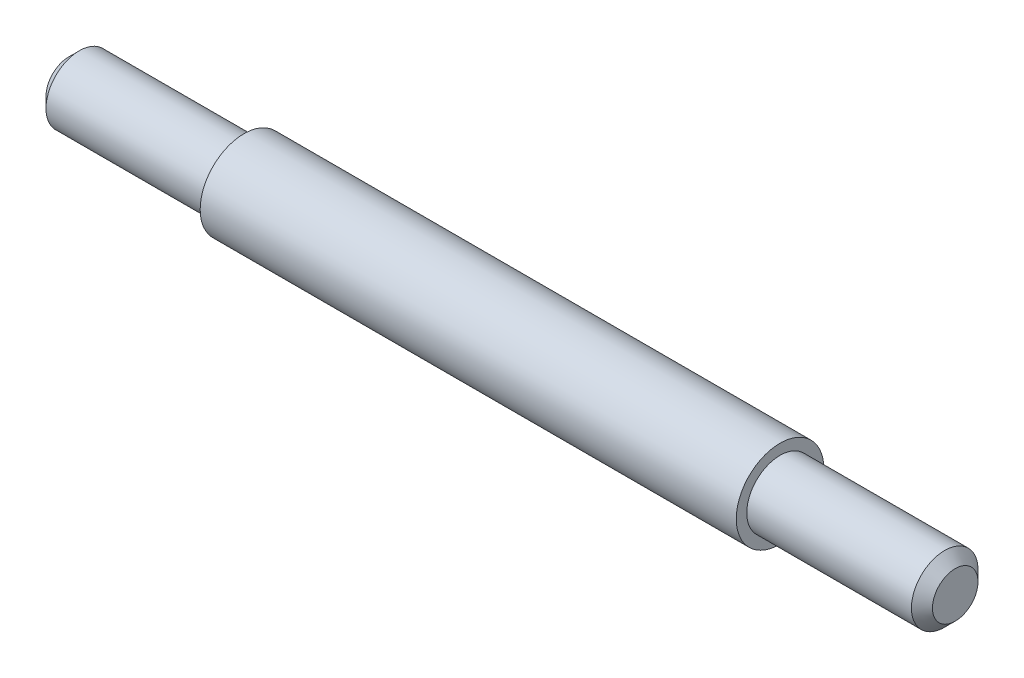
ISO-10303-21;
HEADER;
FILE_DESCRIPTION(('STEP AP214'),'2;1');
FILE_NAME('part.step','',(''),(''),'','','');
FILE_SCHEMA(('AUTOMOTIVE_DESIGN { 1 0 10303 214 1 1 1 1 }'));
ENDSEC;
DATA;
#1=APPLICATION_CONTEXT('core data for automotive mechanical design processes');
#2=APPLICATION_PROTOCOL_DEFINITION('international standard','automotive_design',2000,#1);
#3=PRODUCT_CONTEXT('',#1,'mechanical');
#4=PRODUCT('Part','Part','',(#3));
#5=PRODUCT_RELATED_PRODUCT_CATEGORY('part','',(#4));
#6=PRODUCT_DEFINITION_FORMATION('','',#4);
#7=PRODUCT_DEFINITION_CONTEXT('part definition',#1,'design');
#8=PRODUCT_DEFINITION('design','',#6,#7);
#9=PRODUCT_DEFINITION_SHAPE('','',#8);
#10=(LENGTH_UNIT() NAMED_UNIT(*) SI_UNIT(.MILLI.,.METRE.));
#11=(NAMED_UNIT(*) PLANE_ANGLE_UNIT() SI_UNIT($,.RADIAN.));
#12=(NAMED_UNIT(*) SI_UNIT($,.STERADIAN.) SOLID_ANGLE_UNIT());
#13=UNCERTAINTY_MEASURE_WITH_UNIT(LENGTH_MEASURE(1.E-05),#10,'distance_accuracy_value','');
#14=(GEOMETRIC_REPRESENTATION_CONTEXT(3) GLOBAL_UNCERTAINTY_ASSIGNED_CONTEXT((#13)) GLOBAL_UNIT_ASSIGNED_CONTEXT((#10,
#11,#12)) REPRESENTATION_CONTEXT('',''));
#15=CARTESIAN_POINT('',(0.,0.,0.));
#16=DIRECTION('',(0.,0.,1.));
#17=DIRECTION('',(1.,0.,0.));
#18=AXIS2_PLACEMENT_3D('',#15,#16,#17);
#19=CARTESIAN_POINT('',(-32.131,0.,0.));
#20=DIRECTION('',(1.,0.,0.));
#21=DIRECTION('',(0.,0.,-1.));
#22=AXIS2_PLACEMENT_3D('',#19,#20,#21);
#23=PLANE('',#22);
#24=CARTESIAN_POINT('',(-32.131,0.,0.));
#25=DIRECTION('',(1.,0.,0.));
#26=DIRECTION('',(0.,0.,-1.));
#27=AXIS2_PLACEMENT_3D('',#24,#25,#26);
#28=CIRCLE('',#27,1.651);
#29=CARTESIAN_POINT('',(-32.131,0.,-1.651));
#30=VERTEX_POINT('',#29);
#31=EDGE_CURVE('E62',#30,#30,#28,.F.);
#32=ORIENTED_EDGE('',*,*,#31,.T.);
#33=EDGE_LOOP('',(#32));
#34=FACE_BOUND('',#33,.T.);
#35=ADVANCED_FACE('F43',(#34),#23,.F.);
#36=CARTESIAN_POINT('',(-32.131,0.,0.));
#37=DIRECTION('',(-1.,0.,0.));
#38=DIRECTION('',(0.,0.,1.));
#39=AXIS2_PLACEMENT_3D('',#36,#37,#38);
#40=CYLINDRICAL_SURFACE('',#39,2.413);
#41=CARTESIAN_POINT('',(-31.369,0.,0.));
#42=DIRECTION('',(1.,0.,0.));
#43=DIRECTION('',(0.,0.,-1.));
#44=AXIS2_PLACEMENT_3D('',#41,#42,#43);
#45=CIRCLE('',#44,2.413);
#46=CARTESIAN_POINT('',(-31.369,0.,-2.413));
#47=VERTEX_POINT('',#46);
#48=EDGE_CURVE('E57',#47,#47,#45,.T.);
#49=ORIENTED_EDGE('',*,*,#48,.T.);
#50=EDGE_LOOP('',(#49));
#51=FACE_BOUND('',#50,.T.);
#52=CARTESIAN_POINT('',(-19.431,0.,0.));
#53=DIRECTION('',(-1.,0.,0.));
#54=DIRECTION('',(0.,0.,1.));
#55=AXIS2_PLACEMENT_3D('',#52,#53,#54);
#56=CIRCLE('',#55,2.413);
#57=CARTESIAN_POINT('',(-19.431,0.,2.413));
#58=VERTEX_POINT('',#57);
#59=EDGE_CURVE('E68',#58,#58,#56,.T.);
#60=ORIENTED_EDGE('',*,*,#59,.T.);
#61=EDGE_LOOP('',(#60));
#62=FACE_BOUND('',#61,.T.);
#63=ADVANCED_FACE('F101',(#51,#62),#40,.T.);
#64=CARTESIAN_POINT('',(-19.431,2.413,0.));
#65=DIRECTION('',(1.,0.,0.));
#66=DIRECTION('',(0.,0.,-1.));
#67=AXIS2_PLACEMENT_3D('',#64,#65,#66);
#68=PLANE('',#67);
#69=ORIENTED_EDGE('',*,*,#59,.F.);
#70=EDGE_LOOP('',(#69));
#71=FACE_BOUND('',#70,.T.);
#72=CARTESIAN_POINT('',(-19.431,0.,0.));
#73=DIRECTION('',(-1.,0.,0.));
#74=DIRECTION('',(0.,0.,1.));
#75=AXIS2_PLACEMENT_3D('',#72,#73,#74);
#76=CIRCLE('',#75,3.175);
#77=CARTESIAN_POINT('',(-19.431,0.,3.175));
#78=VERTEX_POINT('',#77);
#79=EDGE_CURVE('E72',#78,#78,#76,.T.);
#80=ORIENTED_EDGE('',*,*,#79,.T.);
#81=EDGE_LOOP('',(#80));
#82=FACE_BOUND('',#81,.T.);
#83=ADVANCED_FACE('F107',(#71,#82),#68,.F.);
#84=CARTESIAN_POINT('',(-32.131,0.,0.));
#85=DIRECTION('',(-1.,0.,0.));
#86=DIRECTION('',(0.,0.,1.));
#87=AXIS2_PLACEMENT_3D('',#84,#85,#86);
#88=CYLINDRICAL_SURFACE('',#87,3.175);
#89=ORIENTED_EDGE('',*,*,#79,.F.);
#90=EDGE_LOOP('',(#89));
#91=FACE_BOUND('',#90,.T.);
#92=CARTESIAN_POINT('',(19.431,0.,0.));
#93=DIRECTION('',(-1.,0.,0.));
#94=DIRECTION('',(0.,0.,1.));
#95=AXIS2_PLACEMENT_3D('',#92,#93,#94);
#96=CIRCLE('',#95,3.175);
#97=CARTESIAN_POINT('',(19.431,0.,3.175));
#98=VERTEX_POINT('',#97);
#99=EDGE_CURVE('E76',#98,#98,#96,.T.);
#100=ORIENTED_EDGE('',*,*,#99,.T.);
#101=EDGE_LOOP('',(#100));
#102=FACE_BOUND('',#101,.T.);
#103=ADVANCED_FACE('F97',(#91,#102),#88,.T.);
#104=CARTESIAN_POINT('',(19.431,3.175,0.));
#105=DIRECTION('',(-1.,0.,0.));
#106=DIRECTION('',(0.,0.,1.));
#107=AXIS2_PLACEMENT_3D('',#104,#105,#106);
#108=PLANE('',#107);
#109=ORIENTED_EDGE('',*,*,#99,.F.);
#110=EDGE_LOOP('',(#109));
#111=FACE_BOUND('',#110,.T.);
#112=CARTESIAN_POINT('',(19.431,0.,0.));
#113=DIRECTION('',(-1.,0.,0.));
#114=DIRECTION('',(0.,0.,1.));
#115=AXIS2_PLACEMENT_3D('',#112,#113,#114);
#116=CIRCLE('',#115,2.413);
#117=CARTESIAN_POINT('',(19.431,0.,2.413));
#118=VERTEX_POINT('',#117);
#119=EDGE_CURVE('E80',#118,#118,#116,.T.);
#120=ORIENTED_EDGE('',*,*,#119,.T.);
#121=EDGE_LOOP('',(#120));
#122=FACE_BOUND('',#121,.T.);
#123=ADVANCED_FACE('F85',(#111,#122),#108,.F.);
#124=CARTESIAN_POINT('',(-32.131,0.,0.));
#125=DIRECTION('',(-1.,0.,0.));
#126=DIRECTION('',(0.,0.,1.));
#127=AXIS2_PLACEMENT_3D('',#124,#125,#126);
#128=CYLINDRICAL_SURFACE('',#127,2.413);
#129=CARTESIAN_POINT('',(31.369,0.,0.));
#130=DIRECTION('',(-1.,0.,0.));
#131=DIRECTION('',(0.,0.,1.));
#132=AXIS2_PLACEMENT_3D('',#129,#130,#131);
#133=CIRCLE('',#132,2.413);
#134=CARTESIAN_POINT('',(31.369,0.,2.413));
#135=VERTEX_POINT('',#134);
#136=EDGE_CURVE('E52',#135,#135,#133,.T.);
#137=ORIENTED_EDGE('',*,*,#136,.T.);
#138=EDGE_LOOP('',(#137));
#139=FACE_BOUND('',#138,.T.);
#140=ORIENTED_EDGE('',*,*,#119,.F.);
#141=EDGE_LOOP('',(#140));
#142=FACE_BOUND('',#141,.T.);
#143=ADVANCED_FACE('F87',(#139,#142),#128,.T.);
#144=CARTESIAN_POINT('',(32.131,2.413,0.));
#145=DIRECTION('',(-1.,0.,0.));
#146=DIRECTION('',(0.,0.,1.));
#147=AXIS2_PLACEMENT_3D('',#144,#145,#146);
#148=PLANE('',#147);
#149=CARTESIAN_POINT('',(32.131,0.,0.));
#150=DIRECTION('',(-1.,0.,0.));
#151=DIRECTION('',(0.,0.,1.));
#152=AXIS2_PLACEMENT_3D('',#149,#150,#151);
#153=CIRCLE('',#152,1.651);
#154=CARTESIAN_POINT('',(32.131,0.,1.651));
#155=VERTEX_POINT('',#154);
#156=EDGE_CURVE('E10',#155,#155,#153,.F.);
#157=ORIENTED_EDGE('',*,*,#156,.T.);
#158=EDGE_LOOP('',(#157));
#159=FACE_BOUND('',#158,.T.);
#160=ADVANCED_FACE('F89',(#159),#148,.F.);
#161=CARTESIAN_POINT('',(-32.131,0.,0.));
#162=DIRECTION('',(1.,0.,0.));
#163=DIRECTION('',(0.,0.,-1.));
#164=AXIS2_PLACEMENT_3D('',#161,#162,#163);
#165=CONICAL_SURFACE('',#164,1.651,0.78539816339745);
#166=ORIENTED_EDGE('',*,*,#48,.F.);
#167=EDGE_LOOP('',(#166));
#168=FACE_BOUND('',#167,.T.);
#169=ORIENTED_EDGE('',*,*,#31,.F.);
#170=EDGE_LOOP('',(#169));
#171=FACE_BOUND('',#170,.T.);
#172=ADVANCED_FACE('F95',(#168,#171),#165,.T.);
#173=CARTESIAN_POINT('',(31.369,0.,0.));
#174=DIRECTION('',(-1.,0.,0.));
#175=DIRECTION('',(0.,0.,1.));
#176=AXIS2_PLACEMENT_3D('',#173,#174,#175);
#177=CONICAL_SURFACE('',#176,2.413,0.785398163397445);
#178=CARTESIAN_POINT('',(32.131,0.,1.651));
#179=CARTESIAN_POINT('',(32.1230625,0.,1.65893749999999));
#180=CARTESIAN_POINT('',(32.115125,0.,1.66687499999999));
#181=CARTESIAN_POINT('',(32.09925,0.,1.68275));
#182=CARTESIAN_POINT('',(32.0913125,0.,1.6906875));
#183=CARTESIAN_POINT('',(32.0754375,0.,1.7065625));
#184=CARTESIAN_POINT('',(32.0675,0.,1.7145));
#185=CARTESIAN_POINT('',(32.051625,0.,1.730375));
#186=CARTESIAN_POINT('',(32.0436875,0.,1.7383125));
#187=CARTESIAN_POINT('',(32.0278125,0.,1.7541875));
#188=CARTESIAN_POINT('',(32.019875,0.,1.762125));
#189=CARTESIAN_POINT('',(32.004,0.,1.778));
#190=CARTESIAN_POINT('',(31.9960625,0.,1.7859375));
#191=CARTESIAN_POINT('',(31.9801875,0.,1.8018125));
#192=CARTESIAN_POINT('',(31.97225,0.,1.80975));
#193=CARTESIAN_POINT('',(31.956375,0.,1.825625));
#194=CARTESIAN_POINT('',(31.9484375,0.,1.8335625));
#195=CARTESIAN_POINT('',(31.9325625,0.,1.8494375));
#196=CARTESIAN_POINT('',(31.924625,0.,1.857375));
#197=CARTESIAN_POINT('',(31.90875,0.,1.87325));
#198=CARTESIAN_POINT('',(31.9008125,0.,1.8811875));
#199=CARTESIAN_POINT('',(31.8849375,0.,1.8970625));
#200=CARTESIAN_POINT('',(31.877,0.,1.905));
#201=CARTESIAN_POINT('',(31.861125,0.,1.920875));
#202=CARTESIAN_POINT('',(31.8531875,0.,1.9288125));
#203=CARTESIAN_POINT('',(31.8373125,0.,1.9446875));
#204=CARTESIAN_POINT('',(31.829375,0.,1.952625));
#205=CARTESIAN_POINT('',(31.8135,0.,1.9685));
#206=CARTESIAN_POINT('',(31.8055625,0.,1.9764375));
#207=CARTESIAN_POINT('',(31.7896875,0.,1.9923125));
#208=CARTESIAN_POINT('',(31.78175,0.,2.00025));
#209=CARTESIAN_POINT('',(31.765875,0.,2.016125));
#210=CARTESIAN_POINT('',(31.7579375,0.,2.0240625));
#211=CARTESIAN_POINT('',(31.7420625,0.,2.0399375));
#212=CARTESIAN_POINT('',(31.734125,0.,2.047875));
#213=CARTESIAN_POINT('',(31.71825,0.,2.06375));
#214=CARTESIAN_POINT('',(31.7103125,0.,2.0716875));
#215=CARTESIAN_POINT('',(31.6944375,0.,2.0875625));
#216=CARTESIAN_POINT('',(31.6865,0.,2.0955));
#217=CARTESIAN_POINT('',(31.670625,0.,2.111375));
#218=CARTESIAN_POINT('',(31.6626875,0.,2.1193125));
#219=CARTESIAN_POINT('',(31.6468125,0.,2.1351875));
#220=CARTESIAN_POINT('',(31.638875,0.,2.143125));
#221=CARTESIAN_POINT('',(31.623,0.,2.159));
#222=CARTESIAN_POINT('',(31.6150625,0.,2.1669375));
#223=CARTESIAN_POINT('',(31.5991875,0.,2.1828125));
#224=CARTESIAN_POINT('',(31.59125,0.,2.19075));
#225=CARTESIAN_POINT('',(31.575375,0.,2.206625));
#226=CARTESIAN_POINT('',(31.5674375,0.,2.2145625));
#227=CARTESIAN_POINT('',(31.5515625,0.,2.2304375));
#228=CARTESIAN_POINT('',(31.543625,0.,2.238375));
#229=CARTESIAN_POINT('',(31.52775,0.,2.25425));
#230=CARTESIAN_POINT('',(31.5198125,0.,2.2621875));
#231=CARTESIAN_POINT('',(31.5039375,0.,2.2780625));
#232=CARTESIAN_POINT('',(31.496,0.,2.286));
#233=CARTESIAN_POINT('',(31.480125,0.,2.301875));
#234=CARTESIAN_POINT('',(31.4721875,0.,2.3098125));
#235=CARTESIAN_POINT('',(31.4563125,0.,2.3256875));
#236=CARTESIAN_POINT('',(31.448375,0.,2.333625));
#237=CARTESIAN_POINT('',(31.4325,0.,2.3495));
#238=CARTESIAN_POINT('',(31.4245625,0.,2.3574375));
#239=CARTESIAN_POINT('',(31.4086875,0.,2.3733125));
#240=CARTESIAN_POINT('',(31.40075,0.,2.38125));
#241=CARTESIAN_POINT('',(31.384875,0.,2.397125));
#242=CARTESIAN_POINT('',(31.3769375,0.,2.4050625));
#243=CARTESIAN_POINT('',(31.369,0.,2.413));
#244=B_SPLINE_CURVE_WITH_KNOTS('',3,(#178,#179,#180,#181,#182,#183,#184,#185,#186,#187,#188,
#189,#190,#191,#192,#193,#194,#195,#196,#197,#198,#199,#200,#201,#202,#203,#204,#205,#206,#207,
#208,#209,#210,#211,#212,#213,#214,#215,#216,#217,#218,#219,#220,#221,#222,#223,#224,#225,#226,
#227,#228,#229,#230,#231,#232,#233,#234,#235,#236,#237,#238,#239,#240,#241,#242,#243),
.UNSPECIFIED.,.F.,.F.,(4,2,2,2,2,2,2,2,2,2,2,2,2,2,2,2,2,2,2,2,2,2,2,2,2,2,2,2,2,2,2,2,4),(0.,
0.0336759604540128,0.0673519209080205,0.101027881362033,0.134703841816041,0.168379802270049,
0.202055762724061,0.235731723178069,0.269407683632077,0.30308364408609,0.336759604540097,
0.370435564994105,0.404111525448118,0.437787485902126,0.471463446356134,0.505139406810146,
0.538815367264154,0.572491327718162,0.606167288172174,0.639843248626182,0.67351920908019,
0.707195169534203,0.74087112998821,0.774547090442218,0.808223050896231,0.841899011350239,
0.875574971804246,0.909250932258259,0.942926892712267,0.976602853166275,1.01027881362029,
1.0439547740743,1.07763073452831),.UNSPECIFIED.);
#245=EDGE_CURVE('BSEAM46',#155,#135,#244,.T.);
#246=ORIENTED_EDGE('',*,*,#156,.F.);
#247=ORIENTED_EDGE('',*,*,#136,.F.);
#248=ORIENTED_EDGE('',*,*,#245,.T.);
#249=ORIENTED_EDGE('',*,*,#245,.F.);
#250=EDGE_LOOP('',(#246,#248,#247,#249));
#251=FACE_BOUND('',#250,.T.);
#252=ADVANCED_FACE('F46',(#251),#177,.T.);
#253=CLOSED_SHELL('',(#35,#63,#83,#103,#123,#143,#160,#172,#252));
#254=MANIFOLD_SOLID_BREP('B2',#253);
#255=ADVANCED_BREP_SHAPE_REPRESENTATION('',(#18,#254),#14);
#256=SHAPE_DEFINITION_REPRESENTATION(#9,#255);
ENDSEC;
END-ISO-10303-21;
